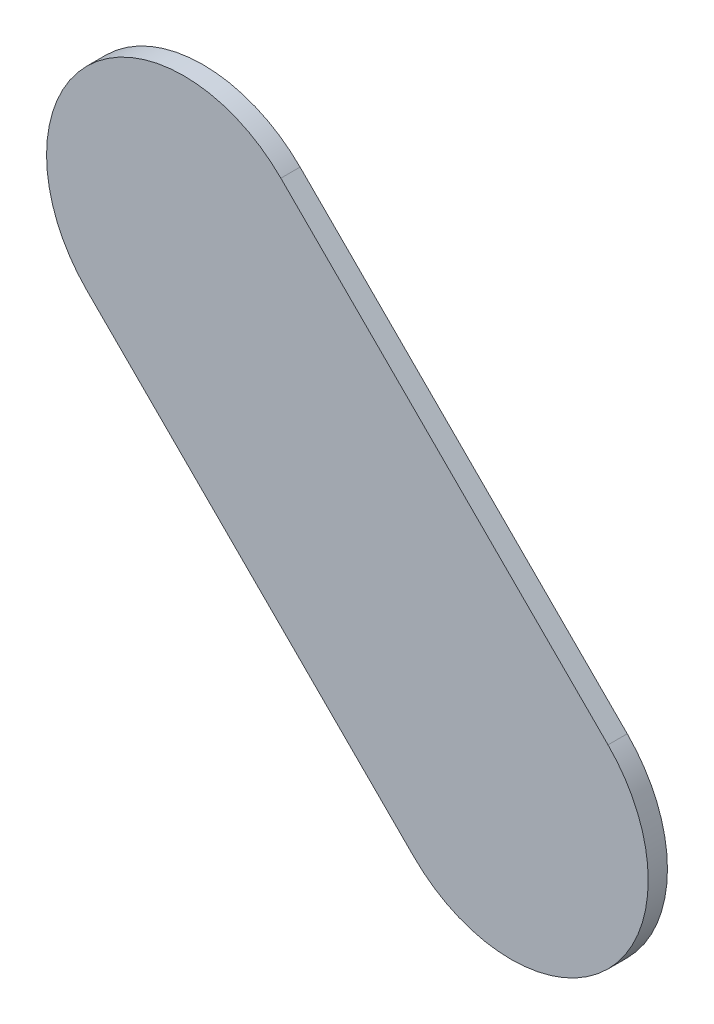
ISO-10303-21;
HEADER;
FILE_DESCRIPTION(('STEP AP214'),'2;1');
FILE_NAME('part.step','',(''),(''),'','','');
FILE_SCHEMA(('AUTOMOTIVE_DESIGN { 1 0 10303 214 1 1 1 1 }'));
ENDSEC;
DATA;
#1=APPLICATION_CONTEXT('core data for automotive mechanical design processes');
#2=APPLICATION_PROTOCOL_DEFINITION('international standard','automotive_design',2000,#1);
#3=PRODUCT_CONTEXT('',#1,'mechanical');
#4=PRODUCT('Part','Part','',(#3));
#5=PRODUCT_RELATED_PRODUCT_CATEGORY('part','',(#4));
#6=PRODUCT_DEFINITION_FORMATION('','',#4);
#7=PRODUCT_DEFINITION_CONTEXT('part definition',#1,'design');
#8=PRODUCT_DEFINITION('design','',#6,#7);
#9=PRODUCT_DEFINITION_SHAPE('','',#8);
#10=(LENGTH_UNIT() NAMED_UNIT(*) SI_UNIT(.MILLI.,.METRE.));
#11=(NAMED_UNIT(*) PLANE_ANGLE_UNIT() SI_UNIT($,.RADIAN.));
#12=(NAMED_UNIT(*) SI_UNIT($,.STERADIAN.) SOLID_ANGLE_UNIT());
#13=UNCERTAINTY_MEASURE_WITH_UNIT(LENGTH_MEASURE(1.E-05),#10,'distance_accuracy_value','');
#14=(GEOMETRIC_REPRESENTATION_CONTEXT(3) GLOBAL_UNCERTAINTY_ASSIGNED_CONTEXT((#13)) GLOBAL_UNIT_ASSIGNED_CONTEXT((#10,
#11,#12)) REPRESENTATION_CONTEXT('',''));
#15=CARTESIAN_POINT('',(0.,0.,0.));
#16=DIRECTION('',(0.,0.,1.));
#17=DIRECTION('',(1.,0.,0.));
#18=AXIS2_PLACEMENT_3D('',#15,#16,#17);
#19=CARTESIAN_POINT('',(110.055776,-120.300723,1.635));
#20=DIRECTION('',(0.,0.,1.));
#21=DIRECTION('',(1.,0.,0.));
#22=AXIS2_PLACEMENT_3D('',#19,#20,#21);
#23=PLANE('',#22);
#24=DIRECTION('',(-0.707106781186548,0.707106781186548,0.));
#25=VECTOR('',#24,1.);
#26=CARTESIAN_POINT('',(110.055776,-120.300723,1.635));
#27=LINE('',#26,#25);
#28=CARTESIAN_POINT('',(110.055776,-120.300723,1.635));
#29=VERTEX_POINT('',#28);
#30=CARTESIAN_POINT('',(109.459776,-119.704723,1.635));
#31=VERTEX_POINT('',#30);
#32=EDGE_CURVE('E70',#29,#31,#27,.T.);
#33=ORIENTED_EDGE('',*,*,#32,.T.);
#34=CARTESIAN_POINT('',(109.2829995,-119.8814995,1.635));
#35=DIRECTION('',(0.,0.,1.));
#36=DIRECTION('',(0.707106781186548,0.707106781186548,0.));
#37=AXIS2_PLACEMENT_3D('',#34,#35,#36);
#38=CIRCLE('',#37,0.249999723809);
#39=CARTESIAN_POINT('',(109.106223,-120.058276,1.635));
#40=VERTEX_POINT('',#39);
#41=EDGE_CURVE('E67',#31,#40,#38,.T.);
#42=ORIENTED_EDGE('',*,*,#41,.T.);
#43=DIRECTION('',(0.707106781186548,-0.707106781186548,0.));
#44=VECTOR('',#43,1.);
#45=CARTESIAN_POINT('',(109.106223,-120.058276,1.635));
#46=LINE('',#45,#44);
#47=CARTESIAN_POINT('',(109.702223,-120.654276,1.635));
#48=VERTEX_POINT('',#47);
#49=EDGE_CURVE('E54',#40,#48,#46,.T.);
#50=ORIENTED_EDGE('',*,*,#49,.T.);
#51=CARTESIAN_POINT('',(109.8789995,-120.4774995,1.635));
#52=DIRECTION('',(0.,0.,1.));
#53=DIRECTION('',(-0.707106781186548,-0.707106781186548,0.));
#54=AXIS2_PLACEMENT_3D('',#51,#52,#53);
#55=CIRCLE('',#54,0.249999723809);
#56=EDGE_CURVE('E11',#48,#29,#55,.T.);
#57=ORIENTED_EDGE('',*,*,#56,.T.);
#58=EDGE_LOOP('',(#33,#42,#50,#57));
#59=FACE_BOUND('',#58,.T.);
#60=ADVANCED_FACE('F17',(#59),#23,.T.);
#61=CARTESIAN_POINT('',(110.055776,-120.300723,1.6));
#62=DIRECTION('',(0.,0.,1.));
#63=DIRECTION('',(1.,0.,0.));
#64=AXIS2_PLACEMENT_3D('',#61,#62,#63);
#65=PLANE('',#64);
#66=CARTESIAN_POINT('',(109.8789995,-120.4774995,1.6));
#67=DIRECTION('',(0.,0.,1.));
#68=DIRECTION('',(-0.707106781186548,-0.707106781186548,0.));
#69=AXIS2_PLACEMENT_3D('',#66,#67,#68);
#70=CIRCLE('',#69,0.249999723809);
#71=CARTESIAN_POINT('',(109.702223,-120.654276,1.6));
#72=VERTEX_POINT('',#71);
#73=CARTESIAN_POINT('',(110.055776,-120.300723,1.6));
#74=VERTEX_POINT('',#73);
#75=EDGE_CURVE('E21',#72,#74,#70,.T.);
#76=ORIENTED_EDGE('',*,*,#75,.F.);
#77=DIRECTION('',(0.707106781186548,-0.707106781186548,0.));
#78=VECTOR('',#77,1.);
#79=CARTESIAN_POINT('',(109.106223,-120.058276,1.6));
#80=LINE('',#79,#78);
#81=CARTESIAN_POINT('',(109.106223,-120.058276,1.6));
#82=VERTEX_POINT('',#81);
#83=EDGE_CURVE('E75',#82,#72,#80,.T.);
#84=ORIENTED_EDGE('',*,*,#83,.F.);
#85=CARTESIAN_POINT('',(109.2829995,-119.8814995,1.6));
#86=DIRECTION('',(0.,0.,1.));
#87=DIRECTION('',(0.707106781186548,0.707106781186548,0.));
#88=AXIS2_PLACEMENT_3D('',#85,#86,#87);
#89=CIRCLE('',#88,0.249999723809);
#90=CARTESIAN_POINT('',(109.459776,-119.704723,1.6));
#91=VERTEX_POINT('',#90);
#92=EDGE_CURVE('E79',#91,#82,#89,.T.);
#93=ORIENTED_EDGE('',*,*,#92,.F.);
#94=DIRECTION('',(-0.707106781186548,0.707106781186548,0.));
#95=VECTOR('',#94,1.);
#96=CARTESIAN_POINT('',(110.055776,-120.300723,1.6));
#97=LINE('',#96,#95);
#98=EDGE_CURVE('E126',#74,#91,#97,.T.);
#99=ORIENTED_EDGE('',*,*,#98,.F.);
#100=EDGE_LOOP('',(#76,#84,#93,#99));
#101=FACE_BOUND('',#100,.T.);
#102=ADVANCED_FACE('F19',(#101),#65,.F.);
#103=CARTESIAN_POINT('',(109.8789995,-120.4774995,1.6));
#104=DIRECTION('',(0.,0.,-1.));
#105=DIRECTION('',(-0.707106781186548,-0.707106781186548,0.));
#106=AXIS2_PLACEMENT_3D('',#103,#104,#105);
#107=CYLINDRICAL_SURFACE('',#106,0.249999723809);
#108=ORIENTED_EDGE('',*,*,#75,.T.);
#109=DIRECTION('',(0.,0.,1.));
#110=VECTOR('',#109,1.);
#111=CARTESIAN_POINT('',(110.055776,-120.300723,1.6));
#112=LINE('',#111,#110);
#113=EDGE_CURVE('E86',#74,#29,#112,.T.);
#114=ORIENTED_EDGE('',*,*,#113,.T.);
#115=ORIENTED_EDGE('',*,*,#56,.F.);
#116=DIRECTION('',(0.,0.,1.));
#117=VECTOR('',#116,1.);
#118=CARTESIAN_POINT('',(109.702223,-120.654276,1.6));
#119=LINE('',#118,#117);
#120=EDGE_CURVE('E61',#72,#48,#119,.T.);
#121=ORIENTED_EDGE('',*,*,#120,.F.);
#122=EDGE_LOOP('',(#108,#114,#115,#121));
#123=FACE_BOUND('',#122,.T.);
#124=ADVANCED_FACE('F151',(#123),#107,.T.);
#125=CARTESIAN_POINT('',(109.106223,-120.058276,1.6));
#126=DIRECTION('',(0.707106781186548,0.707106781186548,0.));
#127=DIRECTION('',(0.,0.,-1.));
#128=AXIS2_PLACEMENT_3D('',#125,#126,#127);
#129=PLANE('',#128);
#130=ORIENTED_EDGE('',*,*,#83,.T.);
#131=ORIENTED_EDGE('',*,*,#120,.T.);
#132=ORIENTED_EDGE('',*,*,#49,.F.);
#133=DIRECTION('',(0.,0.,1.));
#134=VECTOR('',#133,1.);
#135=CARTESIAN_POINT('',(109.106223,-120.058276,1.6));
#136=LINE('',#135,#134);
#137=EDGE_CURVE('E59',#82,#40,#136,.T.);
#138=ORIENTED_EDGE('',*,*,#137,.F.);
#139=EDGE_LOOP('',(#130,#131,#132,#138));
#140=FACE_BOUND('',#139,.T.);
#141=ADVANCED_FACE('F57',(#140),#129,.F.);
#142=CARTESIAN_POINT('',(109.2829995,-119.8814995,1.6));
#143=DIRECTION('',(0.,0.,-1.));
#144=DIRECTION('',(0.707106781186548,0.707106781186548,0.));
#145=AXIS2_PLACEMENT_3D('',#142,#143,#144);
#146=CYLINDRICAL_SURFACE('',#145,0.249999723809);
#147=ORIENTED_EDGE('',*,*,#92,.T.);
#148=ORIENTED_EDGE('',*,*,#137,.T.);
#149=ORIENTED_EDGE('',*,*,#41,.F.);
#150=DIRECTION('',(0.,0.,1.));
#151=VECTOR('',#150,1.);
#152=CARTESIAN_POINT('',(109.459776,-119.704723,1.6));
#153=LINE('',#152,#151);
#154=EDGE_CURVE('E120',#91,#31,#153,.T.);
#155=ORIENTED_EDGE('',*,*,#154,.F.);
#156=EDGE_LOOP('',(#147,#148,#149,#155));
#157=FACE_BOUND('',#156,.T.);
#158=ADVANCED_FACE('F77',(#157),#146,.T.);
#159=CARTESIAN_POINT('',(110.055776,-120.300723,1.6));
#160=DIRECTION('',(-0.707106781186548,-0.707106781186548,0.));
#161=DIRECTION('',(-0.707106781186548,0.707106781186548,0.));
#162=AXIS2_PLACEMENT_3D('',#159,#160,#161);
#163=PLANE('',#162);
#164=ORIENTED_EDGE('',*,*,#98,.T.);
#165=ORIENTED_EDGE('',*,*,#154,.T.);
#166=ORIENTED_EDGE('',*,*,#32,.F.);
#167=ORIENTED_EDGE('',*,*,#113,.F.);
#168=EDGE_LOOP('',(#164,#165,#166,#167));
#169=FACE_BOUND('',#168,.T.);
#170=ADVANCED_FACE('F138',(#169),#163,.F.);
#171=CLOSED_SHELL('',(#60,#102,#124,#141,#158,#170));
#172=MANIFOLD_SOLID_BREP('B1',#171);
#173=ADVANCED_BREP_SHAPE_REPRESENTATION('',(#18,#172),#14);
#174=SHAPE_DEFINITION_REPRESENTATION(#9,#173);
ENDSEC;
END-ISO-10303-21;
